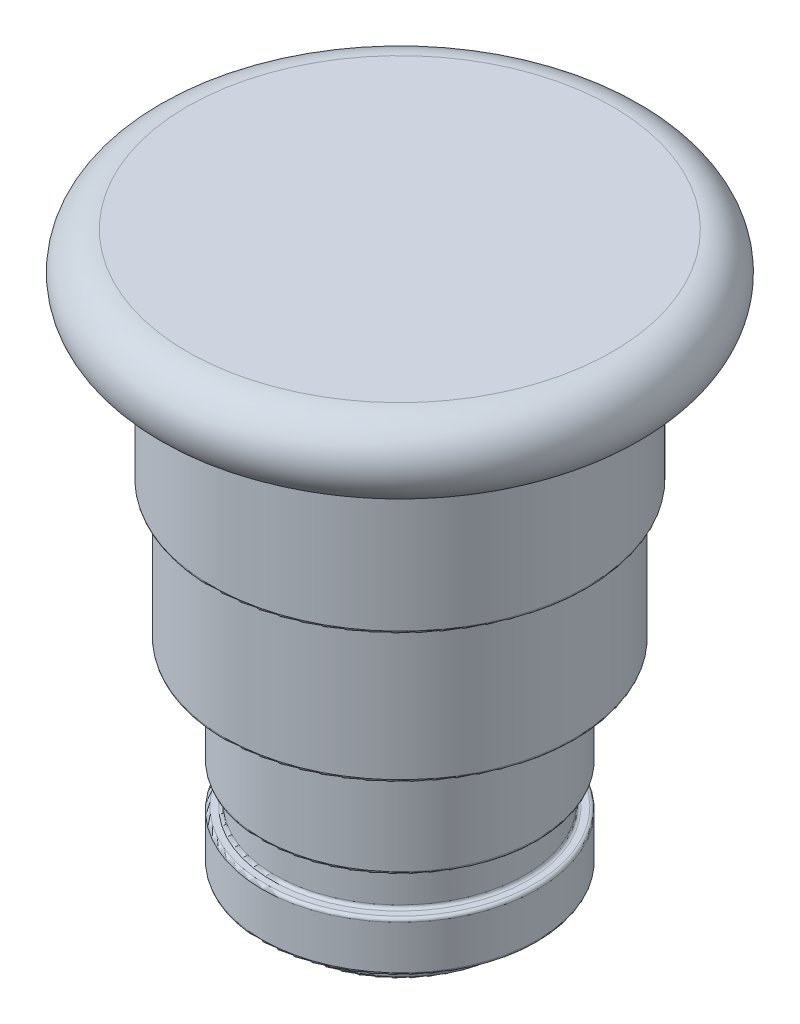
ISO-10303-21;
HEADER;
FILE_DESCRIPTION(('STEP AP214'),'2;1');
FILE_NAME('part.step','',(''),(''),'','','');
FILE_SCHEMA(('AUTOMOTIVE_DESIGN { 1 0 10303 214 1 1 1 1 }'));
ENDSEC;
DATA;
#1=APPLICATION_CONTEXT('core data for automotive mechanical design processes');
#2=APPLICATION_PROTOCOL_DEFINITION('international standard','automotive_design',2000,#1);
#3=PRODUCT_CONTEXT('',#1,'mechanical');
#4=PRODUCT('Part','Part','',(#3));
#5=PRODUCT_RELATED_PRODUCT_CATEGORY('part','',(#4));
#6=PRODUCT_DEFINITION_FORMATION('','',#4);
#7=PRODUCT_DEFINITION_CONTEXT('part definition',#1,'design');
#8=PRODUCT_DEFINITION('design','',#6,#7);
#9=PRODUCT_DEFINITION_SHAPE('','',#8);
#10=(LENGTH_UNIT() NAMED_UNIT(*) SI_UNIT(.MILLI.,.METRE.));
#11=(NAMED_UNIT(*) PLANE_ANGLE_UNIT() SI_UNIT($,.RADIAN.));
#12=(NAMED_UNIT(*) SI_UNIT($,.STERADIAN.) SOLID_ANGLE_UNIT());
#13=UNCERTAINTY_MEASURE_WITH_UNIT(LENGTH_MEASURE(1.E-05),#10,'distance_accuracy_value','');
#14=(GEOMETRIC_REPRESENTATION_CONTEXT(3) GLOBAL_UNCERTAINTY_ASSIGNED_CONTEXT((#13)) GLOBAL_UNIT_ASSIGNED_CONTEXT((#10,
#11,#12)) REPRESENTATION_CONTEXT('',''));
#15=CARTESIAN_POINT('',(0.,0.,0.));
#16=DIRECTION('',(0.,0.,1.));
#17=DIRECTION('',(1.,0.,0.));
#18=AXIS2_PLACEMENT_3D('',#15,#16,#17);
#19=CARTESIAN_POINT('',(0.,0.,0.));
#20=DIRECTION('',(0.,-1.,0.));
#21=DIRECTION('',(1.,0.,0.));
#22=AXIS2_PLACEMENT_3D('',#19,#20,#21);
#23=PLANE('',#22);
#24=CARTESIAN_POINT('',(0.,0.,0.));
#25=DIRECTION('',(0.,-1.,0.));
#26=DIRECTION('',(1.,0.,0.));
#27=AXIS2_PLACEMENT_3D('',#24,#25,#26);
#28=CIRCLE('',#27,8.25);
#29=CARTESIAN_POINT('',(8.25,0.,0.));
#30=VERTEX_POINT('',#29);
#31=EDGE_CURVE('E84',#30,#30,#28,.T.);
#32=ORIENTED_EDGE('',*,*,#31,.T.);
#33=EDGE_LOOP('',(#32));
#34=FACE_BOUND('',#33,.T.);
#35=ADVANCED_FACE('F31',(#34),#23,.T.);
#36=CARTESIAN_POINT('',(-17.,46.,0.));
#37=DIRECTION('',(0.,1.,0.));
#38=DIRECTION('',(-1.,0.,0.));
#39=AXIS2_PLACEMENT_3D('',#36,#37,#38);
#40=PLANE('',#39);
#41=CARTESIAN_POINT('',(0.,46.,0.));
#42=DIRECTION('',(0.,1.,0.));
#43=DIRECTION('',(-1.,0.,0.));
#44=AXIS2_PLACEMENT_3D('',#41,#42,#43);
#45=CIRCLE('',#44,17.);
#46=CARTESIAN_POINT('',(-17.,46.,0.));
#47=VERTEX_POINT('',#46);
#48=EDGE_CURVE('E108',#47,#47,#45,.T.);
#49=ORIENTED_EDGE('',*,*,#48,.T.);
#50=EDGE_LOOP('',(#49));
#51=FACE_BOUND('',#50,.T.);
#52=ADVANCED_FACE('F137',(#51),#40,.T.);
#53=CARTESIAN_POINT('',(0.,43.,0.));
#54=DIRECTION('',(0.,1.,0.));
#55=DIRECTION('',(-1.,0.,0.));
#56=AXIS2_PLACEMENT_3D('',#53,#54,#55);
#57=TOROIDAL_SURFACE('',#56,17.,3.);
#58=CARTESIAN_POINT('',(0.,40.,0.));
#59=DIRECTION('',(0.,1.,0.));
#60=DIRECTION('',(-1.,0.,0.));
#61=AXIS2_PLACEMENT_3D('',#58,#59,#60);
#62=CIRCLE('',#61,17.);
#63=CARTESIAN_POINT('',(-17.,40.,0.));
#64=VERTEX_POINT('',#63);
#65=EDGE_CURVE('E111',#64,#64,#62,.T.);
#66=ORIENTED_EDGE('',*,*,#65,.T.);
#67=EDGE_LOOP('',(#66));
#68=FACE_BOUND('',#67,.T.);
#69=ORIENTED_EDGE('',*,*,#48,.F.);
#70=EDGE_LOOP('',(#69));
#71=FACE_BOUND('',#70,.T.);
#72=ADVANCED_FACE('F115',(#68,#71),#57,.T.);
#73=CARTESIAN_POINT('',(0.,40.,0.));
#74=DIRECTION('',(0.,1.,0.));
#75=DIRECTION('',(-1.,0.,0.));
#76=AXIS2_PLACEMENT_3D('',#73,#74,#75);
#77=CYLINDRICAL_SURFACE('',#76,15.);
#78=CARTESIAN_POINT('',(0.,28.75,0.));
#79=DIRECTION('',(0.,-1.,0.));
#80=DIRECTION('',(1.,0.,0.));
#81=AXIS2_PLACEMENT_3D('',#78,#79,#80);
#82=CIRCLE('',#81,15.);
#83=CARTESIAN_POINT('',(15.,28.75,0.));
#84=VERTEX_POINT('',#83);
#85=EDGE_CURVE('E10',#84,#84,#82,.F.);
#86=ORIENTED_EDGE('',*,*,#85,.T.);
#87=EDGE_LOOP('',(#86));
#88=FACE_BOUND('',#87,.T.);
#89=CARTESIAN_POINT('',(0.,38.,0.));
#90=DIRECTION('',(0.,-1.,0.));
#91=DIRECTION('',(1.,0.,0.));
#92=AXIS2_PLACEMENT_3D('',#89,#90,#91);
#93=CIRCLE('',#92,15.);
#94=CARTESIAN_POINT('',(15.,38.,0.));
#95=VERTEX_POINT('',#94);
#96=EDGE_CURVE('E105',#95,#95,#93,.T.);
#97=ORIENTED_EDGE('',*,*,#96,.T.);
#98=EDGE_LOOP('',(#97));
#99=FACE_BOUND('',#98,.T.);
#100=ADVANCED_FACE('F147',(#88,#99),#77,.T.);
#101=CARTESIAN_POINT('',(-14.,28.5,0.));
#102=DIRECTION('',(0.,-1.,0.));
#103=DIRECTION('',(1.,0.,0.));
#104=AXIS2_PLACEMENT_3D('',#101,#102,#103);
#105=PLANE('',#104);
#106=CARTESIAN_POINT('',(0.,28.5,0.));
#107=DIRECTION('',(0.,-1.,0.));
#108=DIRECTION('',(1.,0.,0.));
#109=AXIS2_PLACEMENT_3D('',#106,#107,#108);
#110=CIRCLE('',#109,14.25);
#111=CARTESIAN_POINT('',(14.25,28.5,0.));
#112=VERTEX_POINT('',#111);
#113=EDGE_CURVE('E38',#112,#112,#110,.F.);
#114=ORIENTED_EDGE('',*,*,#113,.T.);
#115=EDGE_LOOP('',(#114));
#116=FACE_BOUND('',#115,.T.);
#117=CARTESIAN_POINT('',(0.,28.5,0.));
#118=DIRECTION('',(0.,-1.,0.));
#119=DIRECTION('',(1.,0.,0.));
#120=AXIS2_PLACEMENT_3D('',#117,#118,#119);
#121=CIRCLE('',#120,14.75);
#122=CARTESIAN_POINT('',(14.75,28.5,0.));
#123=VERTEX_POINT('',#122);
#124=EDGE_CURVE('E42',#123,#123,#121,.T.);
#125=ORIENTED_EDGE('',*,*,#124,.T.);
#126=EDGE_LOOP('',(#125));
#127=FACE_BOUND('',#126,.T.);
#128=ADVANCED_FACE('F150',(#116,#127),#105,.T.);
#129=CARTESIAN_POINT('',(0.,40.,0.));
#130=DIRECTION('',(0.,1.,0.));
#131=DIRECTION('',(-1.,0.,0.));
#132=AXIS2_PLACEMENT_3D('',#129,#130,#131);
#133=CYLINDRICAL_SURFACE('',#132,14.);
#134=CARTESIAN_POINT('',(0.,17.75,0.));
#135=DIRECTION('',(0.,-1.,0.));
#136=DIRECTION('',(1.,0.,0.));
#137=AXIS2_PLACEMENT_3D('',#134,#135,#136);
#138=CIRCLE('',#137,14.);
#139=CARTESIAN_POINT('',(14.,17.75,0.));
#140=VERTEX_POINT('',#139);
#141=EDGE_CURVE('E46',#140,#140,#138,.F.);
#142=ORIENTED_EDGE('',*,*,#141,.T.);
#143=EDGE_LOOP('',(#142));
#144=FACE_BOUND('',#143,.T.);
#145=CARTESIAN_POINT('',(0.,28.25,0.));
#146=DIRECTION('',(0.,-1.,0.));
#147=DIRECTION('',(1.,0.,0.));
#148=AXIS2_PLACEMENT_3D('',#145,#146,#147);
#149=CIRCLE('',#148,14.);
#150=CARTESIAN_POINT('',(14.,28.25,0.));
#151=VERTEX_POINT('',#150);
#152=EDGE_CURVE('E51',#151,#151,#149,.T.);
#153=ORIENTED_EDGE('',*,*,#152,.T.);
#154=EDGE_LOOP('',(#153));
#155=FACE_BOUND('',#154,.T.);
#156=ADVANCED_FACE('F153',(#144,#155),#133,.T.);
#157=CARTESIAN_POINT('',(-11.,17.5,0.));
#158=DIRECTION('',(0.,-1.,0.));
#159=DIRECTION('',(1.,0.,0.));
#160=AXIS2_PLACEMENT_3D('',#157,#158,#159);
#161=PLANE('',#160);
#162=CARTESIAN_POINT('',(0.,17.5,0.));
#163=DIRECTION('',(0.,-1.,0.));
#164=DIRECTION('',(1.,0.,0.));
#165=AXIS2_PLACEMENT_3D('',#162,#163,#164);
#166=CIRCLE('',#165,11.25);
#167=CARTESIAN_POINT('',(11.25,17.5,0.));
#168=VERTEX_POINT('',#167);
#169=EDGE_CURVE('E54',#168,#168,#166,.F.);
#170=ORIENTED_EDGE('',*,*,#169,.T.);
#171=EDGE_LOOP('',(#170));
#172=FACE_BOUND('',#171,.T.);
#173=CARTESIAN_POINT('',(0.,17.5,0.));
#174=DIRECTION('',(0.,-1.,0.));
#175=DIRECTION('',(1.,0.,0.));
#176=AXIS2_PLACEMENT_3D('',#173,#174,#175);
#177=CIRCLE('',#176,13.75);
#178=CARTESIAN_POINT('',(13.75,17.5,0.));
#179=VERTEX_POINT('',#178);
#180=EDGE_CURVE('E57',#179,#179,#177,.T.);
#181=ORIENTED_EDGE('',*,*,#180,.T.);
#182=EDGE_LOOP('',(#181));
#183=FACE_BOUND('',#182,.T.);
#184=ADVANCED_FACE('F156',(#172,#183),#161,.T.);
#185=CARTESIAN_POINT('',(0.,40.,0.));
#186=DIRECTION('',(0.,1.,0.));
#187=DIRECTION('',(-1.,0.,0.));
#188=AXIS2_PLACEMENT_3D('',#185,#186,#187);
#189=CYLINDRICAL_SURFACE('',#188,11.);
#190=CARTESIAN_POINT('',(0.,9.25,0.));
#191=DIRECTION('',(0.,-1.,0.));
#192=DIRECTION('',(1.,0.,0.));
#193=AXIS2_PLACEMENT_3D('',#190,#191,#192);
#194=CIRCLE('',#193,11.);
#195=CARTESIAN_POINT('',(11.,9.25,0.));
#196=VERTEX_POINT('',#195);
#197=EDGE_CURVE('E60',#196,#196,#194,.F.);
#198=ORIENTED_EDGE('',*,*,#197,.T.);
#199=EDGE_LOOP('',(#198));
#200=FACE_BOUND('',#199,.T.);
#201=CARTESIAN_POINT('',(0.,17.25,0.));
#202=DIRECTION('',(0.,-1.,0.));
#203=DIRECTION('',(1.,0.,0.));
#204=AXIS2_PLACEMENT_3D('',#201,#202,#203);
#205=CIRCLE('',#204,11.);
#206=CARTESIAN_POINT('',(11.,17.25,0.));
#207=VERTEX_POINT('',#206);
#208=EDGE_CURVE('E63',#207,#207,#205,.T.);
#209=ORIENTED_EDGE('',*,*,#208,.T.);
#210=EDGE_LOOP('',(#209));
#211=FACE_BOUND('',#210,.T.);
#212=ADVANCED_FACE('F160',(#200,#211),#189,.T.);
#213=CARTESIAN_POINT('',(-11.,9.,0.));
#214=DIRECTION('',(0.,-1.,0.));
#215=DIRECTION('',(1.,0.,0.));
#216=AXIS2_PLACEMENT_3D('',#213,#214,#215);
#217=PLANE('',#216);
#218=CARTESIAN_POINT('',(0.,9.,0.));
#219=DIRECTION('',(0.,-1.,0.));
#220=DIRECTION('',(1.,0.,0.));
#221=AXIS2_PLACEMENT_3D('',#218,#219,#220);
#222=CIRCLE('',#221,10.25);
#223=CARTESIAN_POINT('',(10.25,9.,0.));
#224=VERTEX_POINT('',#223);
#225=EDGE_CURVE('E66',#224,#224,#222,.F.);
#226=ORIENTED_EDGE('',*,*,#225,.T.);
#227=EDGE_LOOP('',(#226));
#228=FACE_BOUND('',#227,.T.);
#229=CARTESIAN_POINT('',(0.,9.,0.));
#230=DIRECTION('',(0.,-1.,0.));
#231=DIRECTION('',(1.,0.,0.));
#232=AXIS2_PLACEMENT_3D('',#229,#230,#231);
#233=CIRCLE('',#232,10.75);
#234=CARTESIAN_POINT('',(10.75,9.,0.));
#235=VERTEX_POINT('',#234);
#236=EDGE_CURVE('E69',#235,#235,#233,.T.);
#237=ORIENTED_EDGE('',*,*,#236,.T.);
#238=EDGE_LOOP('',(#237));
#239=FACE_BOUND('',#238,.T.);
#240=ADVANCED_FACE('F164',(#228,#239),#217,.T.);
#241=CARTESIAN_POINT('',(0.,40.,0.));
#242=DIRECTION('',(0.,1.,0.));
#243=DIRECTION('',(-1.,0.,0.));
#244=AXIS2_PLACEMENT_3D('',#241,#242,#243);
#245=CYLINDRICAL_SURFACE('',#244,10.);
#246=CARTESIAN_POINT('',(0.,6.25,0.));
#247=DIRECTION('',(0.,1.,0.));
#248=DIRECTION('',(-1.,0.,0.));
#249=AXIS2_PLACEMENT_3D('',#246,#247,#248);
#250=CIRCLE('',#249,10.);
#251=CARTESIAN_POINT('',(-10.,6.25,0.));
#252=VERTEX_POINT('',#251);
#253=EDGE_CURVE('E99',#252,#252,#250,.T.);
#254=ORIENTED_EDGE('',*,*,#253,.T.);
#255=EDGE_LOOP('',(#254));
#256=FACE_BOUND('',#255,.T.);
#257=CARTESIAN_POINT('',(0.,8.75,0.));
#258=DIRECTION('',(0.,-1.,0.));
#259=DIRECTION('',(1.,0.,0.));
#260=AXIS2_PLACEMENT_3D('',#257,#258,#259);
#261=CIRCLE('',#260,10.);
#262=CARTESIAN_POINT('',(10.,8.75,0.));
#263=VERTEX_POINT('',#262);
#264=EDGE_CURVE('E102',#263,#263,#261,.T.);
#265=ORIENTED_EDGE('',*,*,#264,.T.);
#266=EDGE_LOOP('',(#265));
#267=FACE_BOUND('',#266,.T.);
#268=ADVANCED_FACE('F168',(#256,#267),#245,.T.);
#269=CARTESIAN_POINT('',(-11.,6.,0.));
#270=DIRECTION('',(0.,1.,0.));
#271=DIRECTION('',(-1.,0.,0.));
#272=AXIS2_PLACEMENT_3D('',#269,#270,#271);
#273=PLANE('',#272);
#274=CARTESIAN_POINT('',(0.,6.,0.));
#275=DIRECTION('',(0.,1.,0.));
#276=DIRECTION('',(-1.,0.,0.));
#277=AXIS2_PLACEMENT_3D('',#274,#275,#276);
#278=CIRCLE('',#277,10.25);
#279=CARTESIAN_POINT('',(-10.25,6.,0.));
#280=VERTEX_POINT('',#279);
#281=EDGE_CURVE('E93',#280,#280,#278,.F.);
#282=ORIENTED_EDGE('',*,*,#281,.T.);
#283=EDGE_LOOP('',(#282));
#284=FACE_BOUND('',#283,.T.);
#285=CARTESIAN_POINT('',(0.,6.,0.));
#286=DIRECTION('',(0.,1.,0.));
#287=DIRECTION('',(-1.,0.,0.));
#288=AXIS2_PLACEMENT_3D('',#285,#286,#287);
#289=CIRCLE('',#288,10.75);
#290=CARTESIAN_POINT('',(-10.75,6.,0.));
#291=VERTEX_POINT('',#290);
#292=EDGE_CURVE('E96',#291,#291,#289,.T.);
#293=ORIENTED_EDGE('',*,*,#292,.T.);
#294=EDGE_LOOP('',(#293));
#295=FACE_BOUND('',#294,.T.);
#296=ADVANCED_FACE('F172',(#284,#295),#273,.T.);
#297=CARTESIAN_POINT('',(0.,40.,0.));
#298=DIRECTION('',(0.,1.,0.));
#299=DIRECTION('',(-1.,0.,0.));
#300=AXIS2_PLACEMENT_3D('',#297,#298,#299);
#301=CYLINDRICAL_SURFACE('',#300,11.);
#302=CARTESIAN_POINT('',(0.,5.75,0.));
#303=DIRECTION('',(0.,1.,0.));
#304=DIRECTION('',(-1.,0.,0.));
#305=AXIS2_PLACEMENT_3D('',#302,#303,#304);
#306=CIRCLE('',#305,11.);
#307=CARTESIAN_POINT('',(-11.,5.75,0.));
#308=VERTEX_POINT('',#307);
#309=EDGE_CURVE('E72',#308,#308,#306,.F.);
#310=ORIENTED_EDGE('',*,*,#309,.T.);
#311=EDGE_LOOP('',(#310));
#312=FACE_BOUND('',#311,.T.);
#313=CARTESIAN_POINT('',(0.,2.25,0.));
#314=DIRECTION('',(0.,-1.,0.));
#315=DIRECTION('',(1.,0.,0.));
#316=AXIS2_PLACEMENT_3D('',#313,#314,#315);
#317=CIRCLE('',#316,11.);
#318=CARTESIAN_POINT('',(11.,2.25,0.));
#319=VERTEX_POINT('',#318);
#320=EDGE_CURVE('E75',#319,#319,#317,.F.);
#321=ORIENTED_EDGE('',*,*,#320,.T.);
#322=EDGE_LOOP('',(#321));
#323=FACE_BOUND('',#322,.T.);
#324=ADVANCED_FACE('F176',(#312,#323),#301,.T.);
#325=CARTESIAN_POINT('',(-11.,2.,0.));
#326=DIRECTION('',(0.,-1.,0.));
#327=DIRECTION('',(1.,0.,0.));
#328=AXIS2_PLACEMENT_3D('',#325,#326,#327);
#329=PLANE('',#328);
#330=CARTESIAN_POINT('',(0.,2.,0.));
#331=DIRECTION('',(0.,-1.,0.));
#332=DIRECTION('',(1.,0.,0.));
#333=AXIS2_PLACEMENT_3D('',#330,#331,#332);
#334=CIRCLE('',#333,8.75);
#335=CARTESIAN_POINT('',(8.75,2.,0.));
#336=VERTEX_POINT('',#335);
#337=EDGE_CURVE('E78',#336,#336,#334,.F.);
#338=ORIENTED_EDGE('',*,*,#337,.T.);
#339=EDGE_LOOP('',(#338));
#340=FACE_BOUND('',#339,.T.);
#341=CARTESIAN_POINT('',(0.,2.,0.));
#342=DIRECTION('',(0.,-1.,0.));
#343=DIRECTION('',(1.,0.,0.));
#344=AXIS2_PLACEMENT_3D('',#341,#342,#343);
#345=CIRCLE('',#344,10.75);
#346=CARTESIAN_POINT('',(10.75,2.,0.));
#347=VERTEX_POINT('',#346);
#348=EDGE_CURVE('E81',#347,#347,#345,.T.);
#349=ORIENTED_EDGE('',*,*,#348,.T.);
#350=EDGE_LOOP('',(#349));
#351=FACE_BOUND('',#350,.T.);
#352=ADVANCED_FACE('F131',(#340,#351),#329,.T.);
#353=CARTESIAN_POINT('',(0.,40.,0.));
#354=DIRECTION('',(0.,1.,0.));
#355=DIRECTION('',(-1.,0.,0.));
#356=AXIS2_PLACEMENT_3D('',#353,#354,#355);
#357=CYLINDRICAL_SURFACE('',#356,8.5);
#358=CARTESIAN_POINT('',(0.,0.25,0.));
#359=DIRECTION('',(0.,-1.,0.));
#360=DIRECTION('',(1.,0.,0.));
#361=AXIS2_PLACEMENT_3D('',#358,#359,#360);
#362=CIRCLE('',#361,8.5);
#363=CARTESIAN_POINT('',(8.5,0.25,0.));
#364=VERTEX_POINT('',#363);
#365=EDGE_CURVE('E87',#364,#364,#362,.F.);
#366=ORIENTED_EDGE('',*,*,#365,.T.);
#367=EDGE_LOOP('',(#366));
#368=FACE_BOUND('',#367,.T.);
#369=CARTESIAN_POINT('',(0.,1.75,0.));
#370=DIRECTION('',(0.,-1.,0.));
#371=DIRECTION('',(1.,0.,0.));
#372=AXIS2_PLACEMENT_3D('',#369,#370,#371);
#373=CIRCLE('',#372,8.5);
#374=CARTESIAN_POINT('',(8.5,1.75,0.));
#375=VERTEX_POINT('',#374);
#376=EDGE_CURVE('E90',#375,#375,#373,.T.);
#377=ORIENTED_EDGE('',*,*,#376,.T.);
#378=EDGE_LOOP('',(#377));
#379=FACE_BOUND('',#378,.T.);
#380=ADVANCED_FACE('F121',(#368,#379),#357,.T.);
#381=CARTESIAN_POINT('',(0.,38.,0.));
#382=DIRECTION('',(0.,-1.,0.));
#383=DIRECTION('',(1.,0.,0.));
#384=AXIS2_PLACEMENT_3D('',#381,#382,#383);
#385=TOROIDAL_SURFACE('',#384,17.,2.);
#386=ORIENTED_EDGE('',*,*,#96,.F.);
#387=EDGE_LOOP('',(#386));
#388=FACE_BOUND('',#387,.T.);
#389=ORIENTED_EDGE('',*,*,#65,.F.);
#390=EDGE_LOOP('',(#389));
#391=FACE_BOUND('',#390,.T.);
#392=ADVANCED_FACE('F118',(#388,#391),#385,.F.);
#393=CARTESIAN_POINT('',(0.,6.25,0.));
#394=DIRECTION('',(0.,1.,0.));
#395=DIRECTION('',(-1.,0.,0.));
#396=AXIS2_PLACEMENT_3D('',#393,#394,#395);
#397=TOROIDAL_SURFACE('',#396,10.25,0.25);
#398=ORIENTED_EDGE('',*,*,#281,.F.);
#399=EDGE_LOOP('',(#398));
#400=FACE_BOUND('',#399,.T.);
#401=ORIENTED_EDGE('',*,*,#253,.F.);
#402=EDGE_LOOP('',(#401));
#403=FACE_BOUND('',#402,.T.);
#404=ADVANCED_FACE('F120',(#400,#403),#397,.F.);
#405=CARTESIAN_POINT('',(0.,0.25,0.));
#406=DIRECTION('',(0.,-1.,0.));
#407=DIRECTION('',(1.,0.,0.));
#408=AXIS2_PLACEMENT_3D('',#405,#406,#407);
#409=TOROIDAL_SURFACE('',#408,8.25,0.25);
#410=ORIENTED_EDGE('',*,*,#31,.F.);
#411=EDGE_LOOP('',(#410));
#412=FACE_BOUND('',#411,.T.);
#413=ORIENTED_EDGE('',*,*,#365,.F.);
#414=EDGE_LOOP('',(#413));
#415=FACE_BOUND('',#414,.T.);
#416=ADVANCED_FACE('F128',(#412,#415),#409,.T.);
#417=CARTESIAN_POINT('',(0.,1.75,0.));
#418=DIRECTION('',(0.,-1.,0.));
#419=DIRECTION('',(1.,0.,0.));
#420=AXIS2_PLACEMENT_3D('',#417,#418,#419);
#421=TOROIDAL_SURFACE('',#420,8.75,0.25);
#422=ORIENTED_EDGE('',*,*,#376,.F.);
#423=EDGE_LOOP('',(#422));
#424=FACE_BOUND('',#423,.T.);
#425=ORIENTED_EDGE('',*,*,#337,.F.);
#426=EDGE_LOOP('',(#425));
#427=FACE_BOUND('',#426,.T.);
#428=ADVANCED_FACE('F204',(#424,#427),#421,.F.);
#429=CARTESIAN_POINT('',(0.,5.75,0.));
#430=DIRECTION('',(0.,1.,0.));
#431=DIRECTION('',(-1.,0.,0.));
#432=AXIS2_PLACEMENT_3D('',#429,#430,#431);
#433=TOROIDAL_SURFACE('',#432,10.75,0.25);
#434=ORIENTED_EDGE('',*,*,#309,.F.);
#435=EDGE_LOOP('',(#434));
#436=FACE_BOUND('',#435,.T.);
#437=ORIENTED_EDGE('',*,*,#292,.F.);
#438=EDGE_LOOP('',(#437));
#439=FACE_BOUND('',#438,.T.);
#440=ADVANCED_FACE('F193',(#436,#439),#433,.T.);
#441=CARTESIAN_POINT('',(0.,2.25,0.));
#442=DIRECTION('',(0.,-1.,0.));
#443=DIRECTION('',(1.,0.,0.));
#444=AXIS2_PLACEMENT_3D('',#441,#442,#443);
#445=TOROIDAL_SURFACE('',#444,10.75,0.25);
#446=ORIENTED_EDGE('',*,*,#348,.F.);
#447=EDGE_LOOP('',(#446));
#448=FACE_BOUND('',#447,.T.);
#449=ORIENTED_EDGE('',*,*,#320,.F.);
#450=EDGE_LOOP('',(#449));
#451=FACE_BOUND('',#450,.T.);
#452=ADVANCED_FACE('F189',(#448,#451),#445,.T.);
#453=CARTESIAN_POINT('',(0.,8.75,0.));
#454=DIRECTION('',(0.,-1.,0.));
#455=DIRECTION('',(1.,0.,0.));
#456=AXIS2_PLACEMENT_3D('',#453,#454,#455);
#457=TOROIDAL_SURFACE('',#456,10.25,0.25);
#458=ORIENTED_EDGE('',*,*,#264,.F.);
#459=EDGE_LOOP('',(#458));
#460=FACE_BOUND('',#459,.T.);
#461=ORIENTED_EDGE('',*,*,#225,.F.);
#462=EDGE_LOOP('',(#461));
#463=FACE_BOUND('',#462,.T.);
#464=ADVANCED_FACE('F192',(#460,#463),#457,.F.);
#465=CARTESIAN_POINT('',(0.,9.25,0.));
#466=DIRECTION('',(0.,-1.,0.));
#467=DIRECTION('',(1.,0.,0.));
#468=AXIS2_PLACEMENT_3D('',#465,#466,#467);
#469=TOROIDAL_SURFACE('',#468,10.75,0.25);
#470=ORIENTED_EDGE('',*,*,#236,.F.);
#471=EDGE_LOOP('',(#470));
#472=FACE_BOUND('',#471,.T.);
#473=ORIENTED_EDGE('',*,*,#197,.F.);
#474=EDGE_LOOP('',(#473));
#475=FACE_BOUND('',#474,.T.);
#476=ADVANCED_FACE('F201',(#472,#475),#469,.T.);
#477=CARTESIAN_POINT('',(0.,17.25,0.));
#478=DIRECTION('',(0.,-1.,0.));
#479=DIRECTION('',(1.,0.,0.));
#480=AXIS2_PLACEMENT_3D('',#477,#478,#479);
#481=TOROIDAL_SURFACE('',#480,11.25,0.25);
#482=ORIENTED_EDGE('',*,*,#208,.F.);
#483=EDGE_LOOP('',(#482));
#484=FACE_BOUND('',#483,.T.);
#485=ORIENTED_EDGE('',*,*,#169,.F.);
#486=EDGE_LOOP('',(#485));
#487=FACE_BOUND('',#486,.T.);
#488=ADVANCED_FACE('F211',(#484,#487),#481,.F.);
#489=CARTESIAN_POINT('',(0.,17.75,0.));
#490=DIRECTION('',(0.,-1.,0.));
#491=DIRECTION('',(1.,0.,0.));
#492=AXIS2_PLACEMENT_3D('',#489,#490,#491);
#493=TOROIDAL_SURFACE('',#492,13.75,0.25);
#494=ORIENTED_EDGE('',*,*,#180,.F.);
#495=EDGE_LOOP('',(#494));
#496=FACE_BOUND('',#495,.T.);
#497=ORIENTED_EDGE('',*,*,#141,.F.);
#498=EDGE_LOOP('',(#497));
#499=FACE_BOUND('',#498,.T.);
#500=ADVANCED_FACE('F215',(#496,#499),#493,.T.);
#501=CARTESIAN_POINT('',(0.,28.25,0.));
#502=DIRECTION('',(0.,-1.,0.));
#503=DIRECTION('',(1.,0.,0.));
#504=AXIS2_PLACEMENT_3D('',#501,#502,#503);
#505=TOROIDAL_SURFACE('',#504,14.25,0.25);
#506=ORIENTED_EDGE('',*,*,#152,.F.);
#507=EDGE_LOOP('',(#506));
#508=FACE_BOUND('',#507,.T.);
#509=ORIENTED_EDGE('',*,*,#113,.F.);
#510=EDGE_LOOP('',(#509));
#511=FACE_BOUND('',#510,.T.);
#512=ADVANCED_FACE('F218',(#508,#511),#505,.F.);
#513=CARTESIAN_POINT('',(0.,28.75,0.));
#514=DIRECTION('',(0.,-1.,0.));
#515=DIRECTION('',(1.,0.,0.));
#516=AXIS2_PLACEMENT_3D('',#513,#514,#515);
#517=TOROIDAL_SURFACE('',#516,14.75,0.25);
#518=ORIENTED_EDGE('',*,*,#124,.F.);
#519=EDGE_LOOP('',(#518));
#520=FACE_BOUND('',#519,.T.);
#521=ORIENTED_EDGE('',*,*,#85,.F.);
#522=EDGE_LOOP('',(#521));
#523=FACE_BOUND('',#522,.T.);
#524=ADVANCED_FACE('F33',(#520,#523),#517,.T.);
#525=CLOSED_SHELL('',(#35,#52,#72,#100,#128,#156,#184,#212,#240,#268,#296,#324,#352,#380,#392,
#404,#416,#428,#440,#452,#464,#476,#488,#500,#512,#524));
#526=MANIFOLD_SOLID_BREP('B2',#525);
#527=ADVANCED_BREP_SHAPE_REPRESENTATION('',(#18,#526),#14);
#528=SHAPE_DEFINITION_REPRESENTATION(#9,#527);
ENDSEC;
END-ISO-10303-21;
